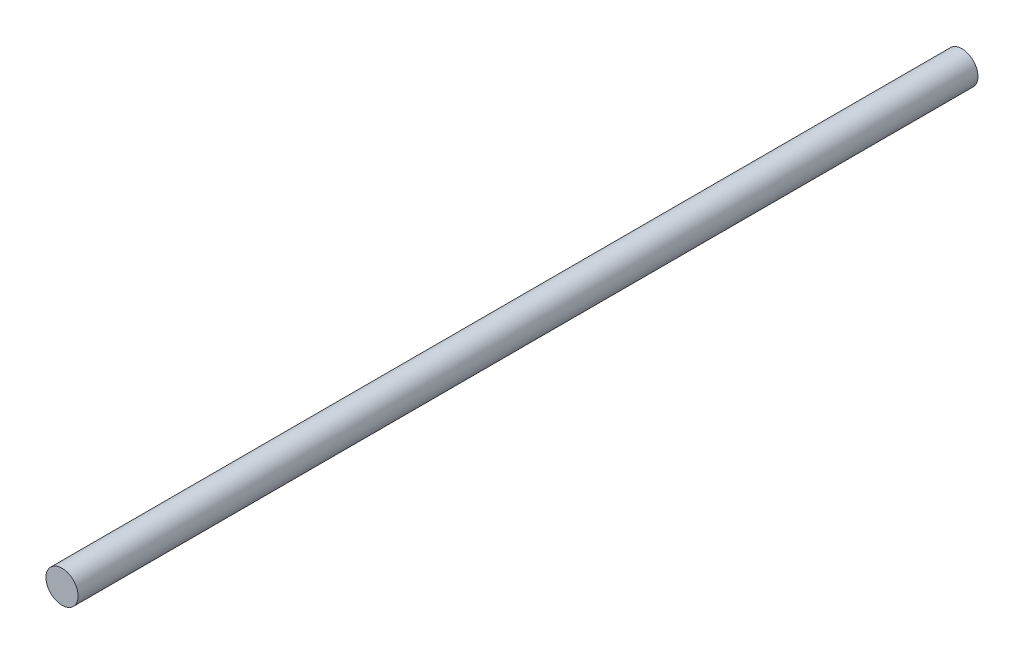
ISO-10303-21;
HEADER;
FILE_DESCRIPTION(('STEP AP214'),'2;1');
FILE_NAME('part.step','',(''),(''),'','','');
FILE_SCHEMA(('AUTOMOTIVE_DESIGN { 1 0 10303 214 1 1 1 1 }'));
ENDSEC;
DATA;
#1=APPLICATION_CONTEXT('core data for automotive mechanical design processes');
#2=APPLICATION_PROTOCOL_DEFINITION('international standard','automotive_design',2000,#1);
#3=PRODUCT_CONTEXT('',#1,'mechanical');
#4=PRODUCT('Part','Part','',(#3));
#5=PRODUCT_RELATED_PRODUCT_CATEGORY('part','',(#4));
#6=PRODUCT_DEFINITION_FORMATION('','',#4);
#7=PRODUCT_DEFINITION_CONTEXT('part definition',#1,'design');
#8=PRODUCT_DEFINITION('design','',#6,#7);
#9=PRODUCT_DEFINITION_SHAPE('','',#8);
#10=(LENGTH_UNIT() NAMED_UNIT(*) SI_UNIT(.MILLI.,.METRE.));
#11=(NAMED_UNIT(*) PLANE_ANGLE_UNIT() SI_UNIT($,.RADIAN.));
#12=(NAMED_UNIT(*) SI_UNIT($,.STERADIAN.) SOLID_ANGLE_UNIT());
#13=UNCERTAINTY_MEASURE_WITH_UNIT(LENGTH_MEASURE(1.E-05),#10,'distance_accuracy_value','');
#14=(GEOMETRIC_REPRESENTATION_CONTEXT(3) GLOBAL_UNCERTAINTY_ASSIGNED_CONTEXT((#13)) GLOBAL_UNIT_ASSIGNED_CONTEXT((#10,
#11,#12)) REPRESENTATION_CONTEXT('',''));
#15=CARTESIAN_POINT('',(0.,0.,0.));
#16=DIRECTION('',(0.,0.,1.));
#17=DIRECTION('',(1.,0.,0.));
#18=AXIS2_PLACEMENT_3D('',#15,#16,#17);
#19=CARTESIAN_POINT('',(0.,0.,130.));
#20=DIRECTION('',(0.,0.,-1.));
#21=DIRECTION('',(-1.,0.,0.));
#22=AXIS2_PLACEMENT_3D('',#19,#20,#21);
#23=CYLINDRICAL_SURFACE('',#22,5.);
#24=CARTESIAN_POINT('',(0.,0.,130.));
#25=DIRECTION('',(0.,0.,1.));
#26=DIRECTION('',(1.,0.,0.));
#27=AXIS2_PLACEMENT_3D('',#24,#25,#26);
#28=CIRCLE('',#27,5.);
#29=CARTESIAN_POINT('',(5.,0.,130.));
#30=VERTEX_POINT('',#29);
#31=EDGE_CURVE('E10',#30,#30,#28,.T.);
#32=ORIENTED_EDGE('',*,*,#31,.F.);
#33=EDGE_LOOP('',(#32));
#34=FACE_BOUND('',#33,.T.);
#35=CARTESIAN_POINT('',(0.,0.,-150.));
#36=DIRECTION('',(0.,0.,1.));
#37=DIRECTION('',(1.,0.,0.));
#38=AXIS2_PLACEMENT_3D('',#35,#36,#37);
#39=CIRCLE('',#38,5.);
#40=CARTESIAN_POINT('',(5.,0.,-150.));
#41=VERTEX_POINT('',#40);
#42=EDGE_CURVE('E46',#41,#41,#39,.T.);
#43=ORIENTED_EDGE('',*,*,#42,.T.);
#44=EDGE_LOOP('',(#43));
#45=FACE_BOUND('',#44,.T.);
#46=ADVANCED_FACE('F43',(#34,#45),#23,.T.);
#47=CARTESIAN_POINT('',(0.,0.,130.));
#48=DIRECTION('',(0.,0.,1.));
#49=DIRECTION('',(1.,0.,0.));
#50=AXIS2_PLACEMENT_3D('',#47,#48,#49);
#51=PLANE('',#50);
#52=ORIENTED_EDGE('',*,*,#31,.T.);
#53=EDGE_LOOP('',(#52));
#54=FACE_BOUND('',#53,.T.);
#55=ADVANCED_FACE('F58',(#54),#51,.T.);
#56=CARTESIAN_POINT('',(0.,0.,-150.));
#57=DIRECTION('',(0.,0.,1.));
#58=DIRECTION('',(1.,0.,0.));
#59=AXIS2_PLACEMENT_3D('',#56,#57,#58);
#60=PLANE('',#59);
#61=ORIENTED_EDGE('',*,*,#42,.F.);
#62=EDGE_LOOP('',(#61));
#63=FACE_BOUND('',#62,.T.);
#64=ADVANCED_FACE('F56',(#63),#60,.F.);
#65=CLOSED_SHELL('',(#46,#55,#64));
#66=MANIFOLD_SOLID_BREP('B2',#65);
#67=ADVANCED_BREP_SHAPE_REPRESENTATION('',(#18,#66),#14);
#68=SHAPE_DEFINITION_REPRESENTATION(#9,#67);
ENDSEC;
END-ISO-10303-21;
